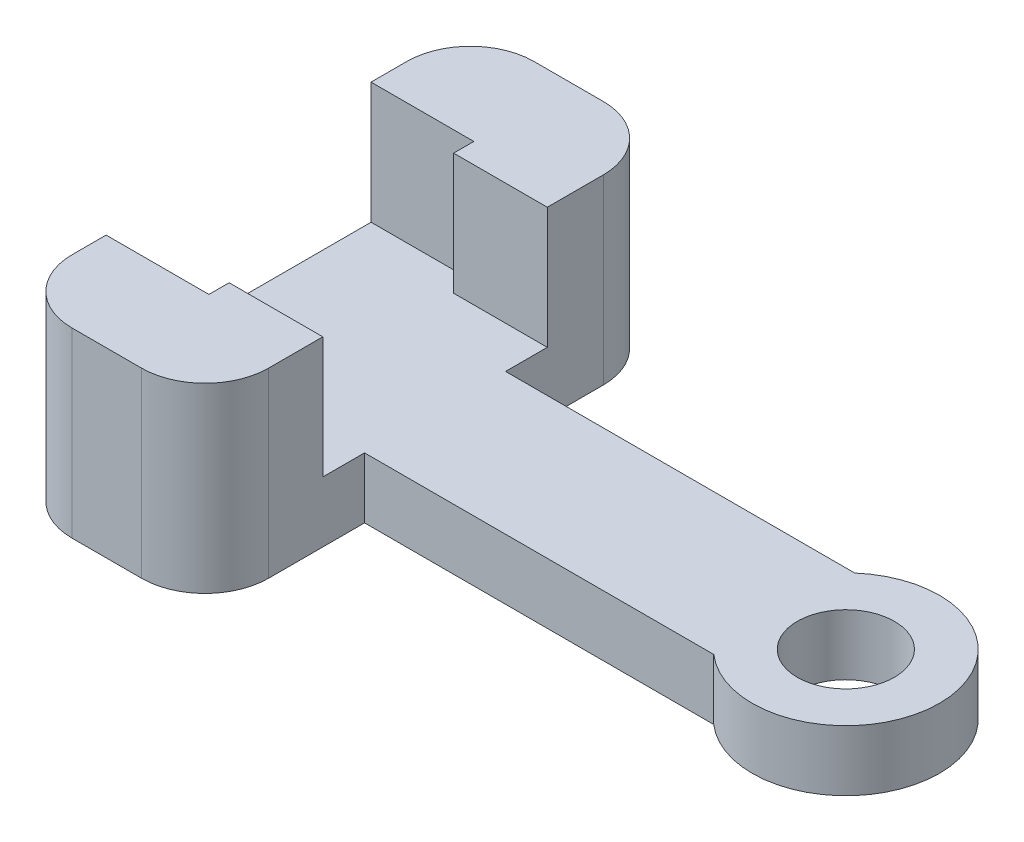
ISO-10303-21;
HEADER;
FILE_DESCRIPTION(('STEP AP214'),'2;1');
FILE_NAME('part.step','',(''),(''),'','','');
FILE_SCHEMA(('AUTOMOTIVE_DESIGN { 1 0 10303 214 1 1 1 1 }'));
ENDSEC;
DATA;
#1=APPLICATION_CONTEXT('core data for automotive mechanical design processes');
#2=APPLICATION_PROTOCOL_DEFINITION('international standard','automotive_design',2000,#1);
#3=PRODUCT_CONTEXT('',#1,'mechanical');
#4=PRODUCT('Part','Part','',(#3));
#5=PRODUCT_RELATED_PRODUCT_CATEGORY('part','',(#4));
#6=PRODUCT_DEFINITION_FORMATION('','',#4);
#7=PRODUCT_DEFINITION_CONTEXT('part definition',#1,'design');
#8=PRODUCT_DEFINITION('design','',#6,#7);
#9=PRODUCT_DEFINITION_SHAPE('','',#8);
#10=(LENGTH_UNIT() NAMED_UNIT(*) SI_UNIT(.MILLI.,.METRE.));
#11=(NAMED_UNIT(*) PLANE_ANGLE_UNIT() SI_UNIT($,.RADIAN.));
#12=(NAMED_UNIT(*) SI_UNIT($,.STERADIAN.) SOLID_ANGLE_UNIT());
#13=UNCERTAINTY_MEASURE_WITH_UNIT(LENGTH_MEASURE(1.E-05),#10,'distance_accuracy_value','');
#14=(GEOMETRIC_REPRESENTATION_CONTEXT(3) GLOBAL_UNCERTAINTY_ASSIGNED_CONTEXT((#13)) GLOBAL_UNIT_ASSIGNED_CONTEXT((#10,
#11,#12)) REPRESENTATION_CONTEXT('',''));
#15=CARTESIAN_POINT('',(0.,0.,0.));
#16=DIRECTION('',(0.,0.,1.));
#17=DIRECTION('',(1.,0.,0.));
#18=AXIS2_PLACEMENT_3D('',#15,#16,#17);
#19=CARTESIAN_POINT('',(38.1627437184587,3.,7.28290251343929));
#20=DIRECTION('',(0.,1.,0.));
#21=DIRECTION('',(0.,0.,1.));
#22=AXIS2_PLACEMENT_3D('',#19,#20,#21);
#23=PLANE('',#22);
#24=DIRECTION('',(1.,0.,0.));
#25=VECTOR('',#24,1.);
#26=CARTESIAN_POINT('',(0.,3.,12.8329025134393));
#27=LINE('',#26,#25);
#28=CARTESIAN_POINT('',(13.2204073400067,3.,12.8329025134393));
#29=VERTEX_POINT('',#28);
#30=CARTESIAN_POINT('',(17.8518941028648,3.,12.8329025134393));
#31=VERTEX_POINT('',#30);
#32=EDGE_CURVE('E182',#29,#31,#27,.T.);
#33=ORIENTED_EDGE('',*,*,#32,.T.);
#34=DIRECTION('',(0.,0.,-1.));
#35=VECTOR('',#34,1.);
#36=CARTESIAN_POINT('',(17.8518941028648,3.,10.7686167991536));
#37=LINE('',#36,#35);
#38=CARTESIAN_POINT('',(17.8518941028648,3.,10.7686167991536));
#39=VERTEX_POINT('',#38);
#40=EDGE_CURVE('E279',#31,#39,#37,.T.);
#41=ORIENTED_EDGE('',*,*,#40,.T.);
#42=DIRECTION('',(1.,0.,0.));
#43=VECTOR('',#42,1.);
#44=CARTESIAN_POINT('',(35.1175065540075,3.,10.7686167991536));
#45=LINE('',#44,#43);
#46=CARTESIAN_POINT('',(35.1175065540075,3.,10.7686167991536));
#47=VERTEX_POINT('',#46);
#48=EDGE_CURVE('E287',#39,#47,#45,.T.);
#49=ORIENTED_EDGE('',*,*,#48,.T.);
#50=CARTESIAN_POINT('',(38.1627437184587,3.,7.28290251343929));
#51=DIRECTION('',(0.,1.,0.));
#52=DIRECTION('',(0.,0.,1.));
#53=AXIS2_PLACEMENT_3D('',#50,#51,#52);
#54=CIRCLE('',#53,4.62857142857144);
#55=CARTESIAN_POINT('',(35.1175065540075,3.,3.79718822772499));
#56=VERTEX_POINT('',#55);
#57=EDGE_CURVE('E316',#47,#56,#54,.T.);
#58=ORIENTED_EDGE('',*,*,#57,.T.);
#59=DIRECTION('',(-1.,0.,0.));
#60=VECTOR('',#59,1.);
#61=CARTESIAN_POINT('',(17.8518941028648,3.,3.79718822772499));
#62=LINE('',#61,#60);
#63=CARTESIAN_POINT('',(17.8518941028648,3.,3.79718822772499));
#64=VERTEX_POINT('',#63);
#65=EDGE_CURVE('E398',#56,#64,#62,.T.);
#66=ORIENTED_EDGE('',*,*,#65,.T.);
#67=DIRECTION('',(0.,0.,-1.));
#68=VECTOR('',#67,1.);
#69=CARTESIAN_POINT('',(17.8518941028648,3.,-1.03641527504467));
#70=LINE('',#69,#68);
#71=CARTESIAN_POINT('',(17.8518941028648,3.,1.7329025134393));
#72=VERTEX_POINT('',#71);
#73=EDGE_CURVE('E280',#64,#72,#70,.T.);
#74=ORIENTED_EDGE('',*,*,#73,.T.);
#75=DIRECTION('',(1.,0.,0.));
#76=VECTOR('',#75,1.);
#77=CARTESIAN_POINT('',(0.,3.,1.7329025134393));
#78=LINE('',#77,#76);
#79=CARTESIAN_POINT('',(13.2204073400067,3.,1.7329025134393));
#80=VERTEX_POINT('',#79);
#81=EDGE_CURVE('E228',#80,#72,#78,.T.);
#82=ORIENTED_EDGE('',*,*,#81,.F.);
#83=DIRECTION('',(0.,0.,1.));
#84=VECTOR('',#83,1.);
#85=CARTESIAN_POINT('',(13.2204073400067,3.,0.));
#86=LINE('',#85,#84);
#87=CARTESIAN_POINT('',(13.2204073400067,3.,0.732902513439297));
#88=VERTEX_POINT('',#87);
#89=EDGE_CURVE('E247',#88,#80,#86,.T.);
#90=ORIENTED_EDGE('',*,*,#89,.F.);
#91=DIRECTION('',(1.,0.,0.));
#92=VECTOR('',#91,1.);
#93=CARTESIAN_POINT('',(0.,3.,0.732902513439297));
#94=LINE('',#93,#92);
#95=CARTESIAN_POINT('',(8.13760838857907,3.,0.732902513439297));
#96=VERTEX_POINT('',#95);
#97=EDGE_CURVE('E184',#96,#88,#94,.T.);
#98=ORIENTED_EDGE('',*,*,#97,.F.);
#99=DIRECTION('',(0.,0.,1.));
#100=VECTOR('',#99,1.);
#101=CARTESIAN_POINT('',(8.13760838857907,3.,15.5114739420107));
#102=LINE('',#101,#100);
#103=CARTESIAN_POINT('',(8.13760838857907,3.,13.8329025134393));
#104=VERTEX_POINT('',#103);
#105=EDGE_CURVE('E276',#96,#104,#102,.T.);
#106=ORIENTED_EDGE('',*,*,#105,.T.);
#107=DIRECTION('',(1.,0.,0.));
#108=VECTOR('',#107,1.);
#109=CARTESIAN_POINT('',(0.,3.,13.8329025134393));
#110=LINE('',#109,#108);
#111=CARTESIAN_POINT('',(13.2204073400067,3.,13.8329025134393));
#112=VERTEX_POINT('',#111);
#113=EDGE_CURVE('E59',#104,#112,#110,.T.);
#114=ORIENTED_EDGE('',*,*,#113,.T.);
#115=DIRECTION('',(0.,0.,1.));
#116=VECTOR('',#115,1.);
#117=CARTESIAN_POINT('',(13.2204073400067,3.,0.));
#118=LINE('',#117,#116);
#119=EDGE_CURVE('E54',#29,#112,#118,.T.);
#120=ORIENTED_EDGE('',*,*,#119,.F.);
#121=EDGE_LOOP('',(#33,#41,#49,#58,#66,#74,#82,#90,#98,#106,#114,#120));
#122=FACE_BOUND('',#121,.T.);
#123=CARTESIAN_POINT('',(38.1627437184587,3.,7.28290251343929));
#124=DIRECTION('',(0.,1.,0.));
#125=DIRECTION('',(0.,0.,1.));
#126=AXIS2_PLACEMENT_3D('',#123,#124,#125);
#127=CIRCLE('',#126,2.4);
#128=CARTESIAN_POINT('',(38.1627437184587,3.,9.68290251343929));
#129=VERTEX_POINT('',#128);
#130=EDGE_CURVE('E294',#129,#129,#127,.T.);
#131=ORIENTED_EDGE('',*,*,#130,.F.);
#132=EDGE_LOOP('',(#131));
#133=FACE_BOUND('',#132,.T.);
#134=ADVANCED_FACE('F37',(#122,#133),#23,.T.);
#135=CARTESIAN_POINT('',(38.1627437184587,0.,7.28290251343929));
#136=DIRECTION('',(0.,1.,0.));
#137=DIRECTION('',(0.,0.,1.));
#138=AXIS2_PLACEMENT_3D('',#135,#136,#137);
#139=PLANE('',#138);
#140=CARTESIAN_POINT('',(38.1627437184587,0.,7.28290251343929));
#141=DIRECTION('',(0.,1.,0.));
#142=DIRECTION('',(0.,0.,1.));
#143=AXIS2_PLACEMENT_3D('',#140,#141,#142);
#144=CIRCLE('',#143,4.62857142857144);
#145=CARTESIAN_POINT('',(35.1175065540075,0.,10.7686167991536));
#146=VERTEX_POINT('',#145);
#147=CARTESIAN_POINT('',(35.1175065540075,0.,3.79718822772499));
#148=VERTEX_POINT('',#147);
#149=EDGE_CURVE('E290',#146,#148,#144,.T.);
#150=ORIENTED_EDGE('',*,*,#149,.F.);
#151=DIRECTION('',(1.,0.,0.));
#152=VECTOR('',#151,1.);
#153=CARTESIAN_POINT('',(35.1175065540075,0.,10.7686167991536));
#154=LINE('',#153,#152);
#155=CARTESIAN_POINT('',(17.8518941028648,0.,10.7686167991536));
#156=VERTEX_POINT('',#155);
#157=EDGE_CURVE('E314',#156,#146,#154,.T.);
#158=ORIENTED_EDGE('',*,*,#157,.F.);
#159=DIRECTION('',(0.,0.,-1.));
#160=VECTOR('',#159,1.);
#161=CARTESIAN_POINT('',(17.8518941028648,0.,10.7686167991536));
#162=LINE('',#161,#160);
#163=CARTESIAN_POINT('',(17.8518941028648,0.,15.5114739420107));
#164=VERTEX_POINT('',#163);
#165=EDGE_CURVE('E312',#164,#156,#162,.T.);
#166=ORIENTED_EDGE('',*,*,#165,.F.);
#167=CARTESIAN_POINT('',(14.7090369600077,0.,15.5114739420107));
#168=DIRECTION('',(0.,1.,0.));
#169=DIRECTION('',(0.,0.,1.));
#170=AXIS2_PLACEMENT_3D('',#167,#168,#169);
#171=CIRCLE('',#170,3.14285714285715);
#172=CARTESIAN_POINT('',(14.7090369600076,0.,18.6543310848679));
#173=VERTEX_POINT('',#172);
#174=EDGE_CURVE('E310',#173,#164,#171,.T.);
#175=ORIENTED_EDGE('',*,*,#174,.F.);
#176=DIRECTION('',(1.,0.,0.));
#177=VECTOR('',#176,1.);
#178=CARTESIAN_POINT('',(14.7090369600076,0.,18.6543310848679));
#179=LINE('',#178,#177);
#180=CARTESIAN_POINT('',(11.2804655314362,0.,18.6543310848679));
#181=VERTEX_POINT('',#180);
#182=EDGE_CURVE('E308',#181,#173,#179,.T.);
#183=ORIENTED_EDGE('',*,*,#182,.F.);
#184=CARTESIAN_POINT('',(11.2804655314362,0.,15.5114739420107));
#185=DIRECTION('',(0.,1.,0.));
#186=DIRECTION('',(0.,0.,1.));
#187=AXIS2_PLACEMENT_3D('',#184,#185,#186);
#188=CIRCLE('',#187,3.14285714285715);
#189=CARTESIAN_POINT('',(8.13760838857907,0.,15.5114739420107));
#190=VERTEX_POINT('',#189);
#191=EDGE_CURVE('E306',#190,#181,#188,.T.);
#192=ORIENTED_EDGE('',*,*,#191,.F.);
#193=DIRECTION('',(0.,0.,1.));
#194=VECTOR('',#193,1.);
#195=CARTESIAN_POINT('',(8.13760838857907,0.,15.5114739420107));
#196=LINE('',#195,#194);
#197=CARTESIAN_POINT('',(8.13760838857907,0.,-1.03641527504467));
#198=VERTEX_POINT('',#197);
#199=EDGE_CURVE('E304',#198,#190,#196,.T.);
#200=ORIENTED_EDGE('',*,*,#199,.F.);
#201=CARTESIAN_POINT('',(11.2804655314362,0.,-1.03641527504468));
#202=DIRECTION('',(0.,1.,0.));
#203=DIRECTION('',(0.,0.,1.));
#204=AXIS2_PLACEMENT_3D('',#201,#202,#203);
#205=CIRCLE('',#204,3.14285714285715);
#206=CARTESIAN_POINT('',(11.2804655314362,0.,-4.17927241790183));
#207=VERTEX_POINT('',#206);
#208=EDGE_CURVE('E302',#207,#198,#205,.T.);
#209=ORIENTED_EDGE('',*,*,#208,.F.);
#210=DIRECTION('',(-1.,0.,0.));
#211=VECTOR('',#210,1.);
#212=CARTESIAN_POINT('',(11.2804655314362,0.,-4.17927241790183));
#213=LINE('',#212,#211);
#214=CARTESIAN_POINT('',(14.7090369600076,0.,-4.17927241790183));
#215=VERTEX_POINT('',#214);
#216=EDGE_CURVE('E300',#215,#207,#213,.T.);
#217=ORIENTED_EDGE('',*,*,#216,.F.);
#218=CARTESIAN_POINT('',(14.7090369600077,0.,-1.03641527504468));
#219=DIRECTION('',(0.,1.,0.));
#220=DIRECTION('',(0.,0.,1.));
#221=AXIS2_PLACEMENT_3D('',#218,#219,#220);
#222=CIRCLE('',#221,3.14285714285715);
#223=CARTESIAN_POINT('',(17.8518941028648,0.,-1.03641527504467));
#224=VERTEX_POINT('',#223);
#225=EDGE_CURVE('E298',#224,#215,#222,.T.);
#226=ORIENTED_EDGE('',*,*,#225,.F.);
#227=DIRECTION('',(0.,0.,-1.));
#228=VECTOR('',#227,1.);
#229=CARTESIAN_POINT('',(17.8518941028648,0.,-1.03641527504467));
#230=LINE('',#229,#228);
#231=CARTESIAN_POINT('',(17.8518941028648,0.,3.79718822772499));
#232=VERTEX_POINT('',#231);
#233=EDGE_CURVE('E296',#232,#224,#230,.T.);
#234=ORIENTED_EDGE('',*,*,#233,.F.);
#235=DIRECTION('',(-1.,0.,0.));
#236=VECTOR('',#235,1.);
#237=CARTESIAN_POINT('',(17.8518941028648,0.,3.79718822772499));
#238=LINE('',#237,#236);
#239=EDGE_CURVE('E293',#148,#232,#238,.T.);
#240=ORIENTED_EDGE('',*,*,#239,.F.);
#241=EDGE_LOOP('',(#150,#158,#166,#175,#183,#192,#200,#209,#217,#226,#234,#240));
#242=FACE_BOUND('',#241,.T.);
#243=CARTESIAN_POINT('',(38.1627437184587,0.,7.28290251343929));
#244=DIRECTION('',(0.,1.,0.));
#245=DIRECTION('',(0.,0.,1.));
#246=AXIS2_PLACEMENT_3D('',#243,#244,#245);
#247=CIRCLE('',#246,2.4);
#248=CARTESIAN_POINT('',(38.1627437184587,0.,9.68290251343929));
#249=VERTEX_POINT('',#248);
#250=EDGE_CURVE('E401',#249,#249,#247,.T.);
#251=ORIENTED_EDGE('',*,*,#250,.T.);
#252=EDGE_LOOP('',(#251));
#253=FACE_BOUND('',#252,.T.);
#254=ADVANCED_FACE('F354',(#242,#253),#139,.F.);
#255=CARTESIAN_POINT('',(38.1627437184587,3.,7.28290251343929));
#256=DIRECTION('',(0.,-1.,0.));
#257=DIRECTION('',(0.,0.,-1.));
#258=AXIS2_PLACEMENT_3D('',#255,#256,#257);
#259=CYLINDRICAL_SURFACE('',#258,4.62857142857144);
#260=ORIENTED_EDGE('',*,*,#149,.T.);
#261=DIRECTION('',(0.,-1.,0.));
#262=VECTOR('',#261,1.);
#263=CARTESIAN_POINT('',(35.1175065540075,3.,3.79718822772499));
#264=LINE('',#263,#262);
#265=EDGE_CURVE('E11',#56,#148,#264,.T.);
#266=ORIENTED_EDGE('',*,*,#265,.F.);
#267=ORIENTED_EDGE('',*,*,#57,.F.);
#268=DIRECTION('',(0.,-1.,0.));
#269=VECTOR('',#268,1.);
#270=CARTESIAN_POINT('',(35.1175065540075,3.,10.7686167991536));
#271=LINE('',#270,#269);
#272=EDGE_CURVE('E289',#47,#146,#271,.T.);
#273=ORIENTED_EDGE('',*,*,#272,.T.);
#274=EDGE_LOOP('',(#260,#266,#267,#273));
#275=FACE_BOUND('',#274,.T.);
#276=ADVANCED_FACE('F39',(#275),#259,.T.);
#277=CARTESIAN_POINT('',(17.8518941028648,3.,3.79718822772499));
#278=DIRECTION('',(0.,0.,1.));
#279=DIRECTION('',(1.,0.,0.));
#280=AXIS2_PLACEMENT_3D('',#277,#278,#279);
#281=PLANE('',#280);
#282=ORIENTED_EDGE('',*,*,#239,.T.);
#283=DIRECTION('',(0.,-1.,0.));
#284=VECTOR('',#283,1.);
#285=CARTESIAN_POINT('',(17.8518941028648,3.,3.79718822772499));
#286=LINE('',#285,#284);
#287=EDGE_CURVE('E46',#64,#232,#286,.T.);
#288=ORIENTED_EDGE('',*,*,#287,.F.);
#289=ORIENTED_EDGE('',*,*,#65,.F.);
#290=ORIENTED_EDGE('',*,*,#265,.T.);
#291=EDGE_LOOP('',(#282,#288,#289,#290));
#292=FACE_BOUND('',#291,.T.);
#293=ADVANCED_FACE('F453',(#292),#281,.F.);
#294=CARTESIAN_POINT('',(17.8518941028648,3.,-1.03641527504467));
#295=DIRECTION('',(-1.,0.,0.));
#296=DIRECTION('',(0.,0.,1.));
#297=AXIS2_PLACEMENT_3D('',#294,#295,#296);
#298=PLANE('',#297);
#299=ORIENTED_EDGE('',*,*,#233,.T.);
#300=DIRECTION('',(0.,-1.,0.));
#301=VECTOR('',#300,1.);
#302=CARTESIAN_POINT('',(17.8518941028648,3.,-1.03641527504467));
#303=LINE('',#302,#301);
#304=CARTESIAN_POINT('',(17.8518941028648,9.,-1.03641527504467));
#305=VERTEX_POINT('',#304);
#306=EDGE_CURVE('E343',#305,#224,#303,.T.);
#307=ORIENTED_EDGE('',*,*,#306,.F.);
#308=DIRECTION('',(0.,0.,-1.));
#309=VECTOR('',#308,1.);
#310=CARTESIAN_POINT('',(17.8518941028648,9.,0.));
#311=LINE('',#310,#309);
#312=CARTESIAN_POINT('',(17.8518941028648,9.,1.7329025134393));
#313=VERTEX_POINT('',#312);
#314=EDGE_CURVE('E232',#313,#305,#311,.T.);
#315=ORIENTED_EDGE('',*,*,#314,.F.);
#316=DIRECTION('',(0.,-1.,0.));
#317=VECTOR('',#316,1.);
#318=CARTESIAN_POINT('',(17.8518941028648,9.,1.7329025134393));
#319=LINE('',#318,#317);
#320=EDGE_CURVE('E259',#313,#72,#319,.T.);
#321=ORIENTED_EDGE('',*,*,#320,.T.);
#322=ORIENTED_EDGE('',*,*,#73,.F.);
#323=ORIENTED_EDGE('',*,*,#287,.T.);
#324=EDGE_LOOP('',(#299,#307,#315,#321,#322,#323));
#325=FACE_BOUND('',#324,.T.);
#326=ADVANCED_FACE('F349',(#325),#298,.F.);
#327=CARTESIAN_POINT('',(14.7090369600077,3.,-1.03641527504468));
#328=DIRECTION('',(0.,-1.,0.));
#329=DIRECTION('',(0.,0.,-1.));
#330=AXIS2_PLACEMENT_3D('',#327,#328,#329);
#331=CYLINDRICAL_SURFACE('',#330,3.14285714285715);
#332=ORIENTED_EDGE('',*,*,#225,.T.);
#333=DIRECTION('',(0.,-1.,0.));
#334=VECTOR('',#333,1.);
#335=CARTESIAN_POINT('',(14.7090369600076,3.,-4.17927241790183));
#336=LINE('',#335,#334);
#337=CARTESIAN_POINT('',(14.7090369600076,9.,-4.17927241790183));
#338=VERTEX_POINT('',#337);
#339=EDGE_CURVE('E340',#338,#215,#336,.T.);
#340=ORIENTED_EDGE('',*,*,#339,.F.);
#341=CARTESIAN_POINT('',(14.7090369600077,9.,-1.03641527504468));
#342=DIRECTION('',(0.,1.,0.));
#343=DIRECTION('',(0.,0.,1.));
#344=AXIS2_PLACEMENT_3D('',#341,#342,#343);
#345=CIRCLE('',#344,3.14285714285715);
#346=EDGE_CURVE('E235',#305,#338,#345,.T.);
#347=ORIENTED_EDGE('',*,*,#346,.F.);
#348=ORIENTED_EDGE('',*,*,#306,.T.);
#349=EDGE_LOOP('',(#332,#340,#347,#348));
#350=FACE_BOUND('',#349,.T.);
#351=ADVANCED_FACE('F359',(#350),#331,.T.);
#352=CARTESIAN_POINT('',(11.2804655314362,3.,-4.17927241790183));
#353=DIRECTION('',(0.,0.,1.));
#354=DIRECTION('',(1.,0.,0.));
#355=AXIS2_PLACEMENT_3D('',#352,#353,#354);
#356=PLANE('',#355);
#357=ORIENTED_EDGE('',*,*,#216,.T.);
#358=DIRECTION('',(0.,-1.,0.));
#359=VECTOR('',#358,1.);
#360=CARTESIAN_POINT('',(11.2804655314362,3.,-4.17927241790183));
#361=LINE('',#360,#359);
#362=CARTESIAN_POINT('',(11.2804655314362,9.,-4.17927241790183));
#363=VERTEX_POINT('',#362);
#364=EDGE_CURVE('E337',#363,#207,#361,.T.);
#365=ORIENTED_EDGE('',*,*,#364,.F.);
#366=DIRECTION('',(-1.,0.,0.));
#367=VECTOR('',#366,1.);
#368=CARTESIAN_POINT('',(0.,9.,-4.17927241790183));
#369=LINE('',#368,#367);
#370=EDGE_CURVE('E238',#338,#363,#369,.T.);
#371=ORIENTED_EDGE('',*,*,#370,.F.);
#372=ORIENTED_EDGE('',*,*,#339,.T.);
#373=EDGE_LOOP('',(#357,#365,#371,#372));
#374=FACE_BOUND('',#373,.T.);
#375=ADVANCED_FACE('F363',(#374),#356,.F.);
#376=CARTESIAN_POINT('',(11.2804655314362,3.,-1.03641527504468));
#377=DIRECTION('',(0.,-1.,0.));
#378=DIRECTION('',(0.,0.,-1.));
#379=AXIS2_PLACEMENT_3D('',#376,#377,#378);
#380=CYLINDRICAL_SURFACE('',#379,3.14285714285715);
#381=ORIENTED_EDGE('',*,*,#208,.T.);
#382=DIRECTION('',(0.,-1.,0.));
#383=VECTOR('',#382,1.);
#384=CARTESIAN_POINT('',(8.13760838857907,3.,-1.03641527504467));
#385=LINE('',#384,#383);
#386=CARTESIAN_POINT('',(8.13760838857907,9.,-1.03641527504467));
#387=VERTEX_POINT('',#386);
#388=EDGE_CURVE('E334',#387,#198,#385,.T.);
#389=ORIENTED_EDGE('',*,*,#388,.F.);
#390=CARTESIAN_POINT('',(11.2804655314362,9.,-1.03641527504468));
#391=DIRECTION('',(0.,1.,0.));
#392=DIRECTION('',(0.,0.,1.));
#393=AXIS2_PLACEMENT_3D('',#390,#391,#392);
#394=CIRCLE('',#393,3.14285714285715);
#395=EDGE_CURVE('E241',#363,#387,#394,.T.);
#396=ORIENTED_EDGE('',*,*,#395,.F.);
#397=ORIENTED_EDGE('',*,*,#364,.T.);
#398=EDGE_LOOP('',(#381,#389,#396,#397));
#399=FACE_BOUND('',#398,.T.);
#400=ADVANCED_FACE('F369',(#399),#380,.T.);
#401=CARTESIAN_POINT('',(8.13760838857907,3.,15.5114739420107));
#402=DIRECTION('',(1.,0.,0.));
#403=DIRECTION('',(0.,0.,-1.));
#404=AXIS2_PLACEMENT_3D('',#401,#402,#403);
#405=PLANE('',#404);
#406=ORIENTED_EDGE('',*,*,#199,.T.);
#407=DIRECTION('',(0.,-1.,0.));
#408=VECTOR('',#407,1.);
#409=CARTESIAN_POINT('',(8.13760838857907,3.,15.5114739420107));
#410=LINE('',#409,#408);
#411=CARTESIAN_POINT('',(8.13760838857907,9.,15.5114739420107));
#412=VERTEX_POINT('',#411);
#413=EDGE_CURVE('E331',#412,#190,#410,.T.);
#414=ORIENTED_EDGE('',*,*,#413,.F.);
#415=DIRECTION('',(0.,0.,1.));
#416=VECTOR('',#415,1.);
#417=CARTESIAN_POINT('',(8.13760838857907,9.,0.));
#418=LINE('',#417,#416);
#419=CARTESIAN_POINT('',(8.13760838857907,9.,13.8329025134393));
#420=VERTEX_POINT('',#419);
#421=EDGE_CURVE('E204',#420,#412,#418,.T.);
#422=ORIENTED_EDGE('',*,*,#421,.F.);
#423=DIRECTION('',(0.,-1.,0.));
#424=VECTOR('',#423,1.);
#425=CARTESIAN_POINT('',(8.13760838857907,9.,13.8329025134393));
#426=LINE('',#425,#424);
#427=EDGE_CURVE('E220',#420,#104,#426,.T.);
#428=ORIENTED_EDGE('',*,*,#427,.T.);
#429=ORIENTED_EDGE('',*,*,#105,.F.);
#430=DIRECTION('',(0.,-1.,0.));
#431=VECTOR('',#430,1.);
#432=CARTESIAN_POINT('',(8.13760838857907,9.,0.732902513439297));
#433=LINE('',#432,#431);
#434=CARTESIAN_POINT('',(8.13760838857907,9.,0.732902513439297));
#435=VERTEX_POINT('',#434);
#436=EDGE_CURVE('E246',#435,#96,#433,.T.);
#437=ORIENTED_EDGE('',*,*,#436,.F.);
#438=DIRECTION('',(0.,0.,1.));
#439=VECTOR('',#438,1.);
#440=CARTESIAN_POINT('',(8.13760838857907,9.,0.));
#441=LINE('',#440,#439);
#442=EDGE_CURVE('E244',#387,#435,#441,.T.);
#443=ORIENTED_EDGE('',*,*,#442,.F.);
#444=ORIENTED_EDGE('',*,*,#388,.T.);
#445=EDGE_LOOP('',(#406,#414,#422,#428,#429,#437,#443,#444));
#446=FACE_BOUND('',#445,.T.);
#447=ADVANCED_FACE('F372',(#446),#405,.F.);
#448=CARTESIAN_POINT('',(11.2804655314362,3.,15.5114739420107));
#449=DIRECTION('',(0.,-1.,0.));
#450=DIRECTION('',(0.,0.,-1.));
#451=AXIS2_PLACEMENT_3D('',#448,#449,#450);
#452=CYLINDRICAL_SURFACE('',#451,3.14285714285715);
#453=ORIENTED_EDGE('',*,*,#191,.T.);
#454=DIRECTION('',(0.,-1.,0.));
#455=VECTOR('',#454,1.);
#456=CARTESIAN_POINT('',(11.2804655314362,3.,18.6543310848679));
#457=LINE('',#456,#455);
#458=CARTESIAN_POINT('',(11.2804655314362,9.,18.6543310848679));
#459=VERTEX_POINT('',#458);
#460=EDGE_CURVE('E328',#459,#181,#457,.T.);
#461=ORIENTED_EDGE('',*,*,#460,.F.);
#462=CARTESIAN_POINT('',(11.2804655314362,9.,15.5114739420107));
#463=DIRECTION('',(0.,1.,0.));
#464=DIRECTION('',(0.,0.,1.));
#465=AXIS2_PLACEMENT_3D('',#462,#463,#464);
#466=CIRCLE('',#465,3.14285714285715);
#467=EDGE_CURVE('E207',#412,#459,#466,.T.);
#468=ORIENTED_EDGE('',*,*,#467,.F.);
#469=ORIENTED_EDGE('',*,*,#413,.T.);
#470=EDGE_LOOP('',(#453,#461,#468,#469));
#471=FACE_BOUND('',#470,.T.);
#472=ADVANCED_FACE('F377',(#471),#452,.T.);
#473=CARTESIAN_POINT('',(14.7090369600076,3.,18.6543310848679));
#474=DIRECTION('',(0.,0.,-1.));
#475=DIRECTION('',(-1.,0.,0.));
#476=AXIS2_PLACEMENT_3D('',#473,#474,#475);
#477=PLANE('',#476);
#478=ORIENTED_EDGE('',*,*,#182,.T.);
#479=DIRECTION('',(0.,-1.,0.));
#480=VECTOR('',#479,1.);
#481=CARTESIAN_POINT('',(14.7090369600076,3.,18.6543310848679));
#482=LINE('',#481,#480);
#483=CARTESIAN_POINT('',(14.7090369600077,9.,18.6543310848679));
#484=VERTEX_POINT('',#483);
#485=EDGE_CURVE('E325',#484,#173,#482,.T.);
#486=ORIENTED_EDGE('',*,*,#485,.F.);
#487=DIRECTION('',(1.,0.,0.));
#488=VECTOR('',#487,1.);
#489=CARTESIAN_POINT('',(0.,9.,18.6543310848679));
#490=LINE('',#489,#488);
#491=EDGE_CURVE('E210',#459,#484,#490,.T.);
#492=ORIENTED_EDGE('',*,*,#491,.F.);
#493=ORIENTED_EDGE('',*,*,#460,.T.);
#494=EDGE_LOOP('',(#478,#486,#492,#493));
#495=FACE_BOUND('',#494,.T.);
#496=ADVANCED_FACE('F381',(#495),#477,.F.);
#497=CARTESIAN_POINT('',(14.7090369600077,3.,15.5114739420107));
#498=DIRECTION('',(0.,-1.,0.));
#499=DIRECTION('',(0.,0.,-1.));
#500=AXIS2_PLACEMENT_3D('',#497,#498,#499);
#501=CYLINDRICAL_SURFACE('',#500,3.14285714285715);
#502=ORIENTED_EDGE('',*,*,#174,.T.);
#503=DIRECTION('',(0.,-1.,0.));
#504=VECTOR('',#503,1.);
#505=CARTESIAN_POINT('',(17.8518941028648,3.,15.5114739420107));
#506=LINE('',#505,#504);
#507=CARTESIAN_POINT('',(17.8518941028648,9.,15.5114739420107));
#508=VERTEX_POINT('',#507);
#509=EDGE_CURVE('E322',#508,#164,#506,.T.);
#510=ORIENTED_EDGE('',*,*,#509,.F.);
#511=CARTESIAN_POINT('',(14.7090369600077,9.,15.5114739420107));
#512=DIRECTION('',(0.,1.,0.));
#513=DIRECTION('',(0.,0.,1.));
#514=AXIS2_PLACEMENT_3D('',#511,#512,#513);
#515=CIRCLE('',#514,3.14285714285715);
#516=EDGE_CURVE('E213',#484,#508,#515,.T.);
#517=ORIENTED_EDGE('',*,*,#516,.F.);
#518=ORIENTED_EDGE('',*,*,#485,.T.);
#519=EDGE_LOOP('',(#502,#510,#517,#518));
#520=FACE_BOUND('',#519,.T.);
#521=ADVANCED_FACE('F384',(#520),#501,.T.);
#522=CARTESIAN_POINT('',(17.8518941028648,3.,10.7686167991536));
#523=DIRECTION('',(-1.,0.,0.));
#524=DIRECTION('',(0.,0.,1.));
#525=AXIS2_PLACEMENT_3D('',#522,#523,#524);
#526=PLANE('',#525);
#527=ORIENTED_EDGE('',*,*,#165,.T.);
#528=DIRECTION('',(0.,-1.,0.));
#529=VECTOR('',#528,1.);
#530=CARTESIAN_POINT('',(17.8518941028648,3.,10.7686167991536));
#531=LINE('',#530,#529);
#532=EDGE_CURVE('E319',#39,#156,#531,.T.);
#533=ORIENTED_EDGE('',*,*,#532,.F.);
#534=ORIENTED_EDGE('',*,*,#40,.F.);
#535=DIRECTION('',(0.,-1.,0.));
#536=VECTOR('',#535,1.);
#537=CARTESIAN_POINT('',(17.8518941028648,9.,12.8329025134393));
#538=LINE('',#537,#536);
#539=CARTESIAN_POINT('',(17.8518941028648,9.,12.8329025134393));
#540=VERTEX_POINT('',#539);
#541=EDGE_CURVE('E216',#540,#31,#538,.T.);
#542=ORIENTED_EDGE('',*,*,#541,.F.);
#543=DIRECTION('',(0.,0.,-1.));
#544=VECTOR('',#543,1.);
#545=CARTESIAN_POINT('',(17.8518941028648,9.,0.));
#546=LINE('',#545,#544);
#547=EDGE_CURVE('E198',#508,#540,#546,.T.);
#548=ORIENTED_EDGE('',*,*,#547,.F.);
#549=ORIENTED_EDGE('',*,*,#509,.T.);
#550=EDGE_LOOP('',(#527,#533,#534,#542,#548,#549));
#551=FACE_BOUND('',#550,.T.);
#552=ADVANCED_FACE('F387',(#551),#526,.F.);
#553=CARTESIAN_POINT('',(35.1175065540075,3.,10.7686167991536));
#554=DIRECTION('',(0.,0.,-1.));
#555=DIRECTION('',(-1.,0.,0.));
#556=AXIS2_PLACEMENT_3D('',#553,#554,#555);
#557=PLANE('',#556);
#558=ORIENTED_EDGE('',*,*,#157,.T.);
#559=ORIENTED_EDGE('',*,*,#272,.F.);
#560=ORIENTED_EDGE('',*,*,#48,.F.);
#561=ORIENTED_EDGE('',*,*,#532,.T.);
#562=EDGE_LOOP('',(#558,#559,#560,#561));
#563=FACE_BOUND('',#562,.T.);
#564=ADVANCED_FACE('F392',(#563),#557,.F.);
#565=CARTESIAN_POINT('',(38.1627437184587,3.,7.28290251343929));
#566=DIRECTION('',(0.,-1.,0.));
#567=DIRECTION('',(0.,0.,-1.));
#568=AXIS2_PLACEMENT_3D('',#565,#566,#567);
#569=CYLINDRICAL_SURFACE('',#568,2.4);
#570=ORIENTED_EDGE('',*,*,#130,.T.);
#571=EDGE_LOOP('',(#570));
#572=FACE_BOUND('',#571,.T.);
#573=ORIENTED_EDGE('',*,*,#250,.F.);
#574=EDGE_LOOP('',(#573));
#575=FACE_BOUND('',#574,.T.);
#576=ADVANCED_FACE('F431',(#572,#575),#569,.F.);
#577=CARTESIAN_POINT('',(0.,9.,0.732902513439297));
#578=DIRECTION('',(0.,0.,-1.));
#579=DIRECTION('',(-1.,0.,0.));
#580=AXIS2_PLACEMENT_3D('',#577,#578,#579);
#581=PLANE('',#580);
#582=ORIENTED_EDGE('',*,*,#97,.T.);
#583=DIRECTION('',(0.,-1.,0.));
#584=VECTOR('',#583,1.);
#585=CARTESIAN_POINT('',(13.2204073400067,9.,0.732902513439297));
#586=LINE('',#585,#584);
#587=CARTESIAN_POINT('',(13.2204073400067,9.,0.732902513439297));
#588=VERTEX_POINT('',#587);
#589=EDGE_CURVE('E266',#588,#88,#586,.T.);
#590=ORIENTED_EDGE('',*,*,#589,.F.);
#591=DIRECTION('',(1.,0.,0.));
#592=VECTOR('',#591,1.);
#593=CARTESIAN_POINT('',(0.,9.,0.732902513439297));
#594=LINE('',#593,#592);
#595=EDGE_CURVE('E224',#435,#588,#594,.T.);
#596=ORIENTED_EDGE('',*,*,#595,.F.);
#597=ORIENTED_EDGE('',*,*,#436,.T.);
#598=EDGE_LOOP('',(#582,#590,#596,#597));
#599=FACE_BOUND('',#598,.T.);
#600=ADVANCED_FACE('F410',(#599),#581,.F.);
#601=CARTESIAN_POINT('',(13.2204073400067,9.,0.));
#602=DIRECTION('',(1.,0.,0.));
#603=DIRECTION('',(0.,0.,-1.));
#604=AXIS2_PLACEMENT_3D('',#601,#602,#603);
#605=PLANE('',#604);
#606=ORIENTED_EDGE('',*,*,#89,.T.);
#607=DIRECTION('',(0.,-1.,0.));
#608=VECTOR('',#607,1.);
#609=CARTESIAN_POINT('',(13.2204073400067,9.,1.7329025134393));
#610=LINE('',#609,#608);
#611=CARTESIAN_POINT('',(13.2204073400067,9.,1.7329025134393));
#612=VERTEX_POINT('',#611);
#613=EDGE_CURVE('E252',#612,#80,#610,.T.);
#614=ORIENTED_EDGE('',*,*,#613,.F.);
#615=DIRECTION('',(0.,0.,1.));
#616=VECTOR('',#615,1.);
#617=CARTESIAN_POINT('',(13.2204073400067,9.,0.));
#618=LINE('',#617,#616);
#619=EDGE_CURVE('E227',#588,#612,#618,.T.);
#620=ORIENTED_EDGE('',*,*,#619,.F.);
#621=ORIENTED_EDGE('',*,*,#589,.T.);
#622=EDGE_LOOP('',(#606,#614,#620,#621));
#623=FACE_BOUND('',#622,.T.);
#624=ADVANCED_FACE('F408',(#623),#605,.F.);
#625=CARTESIAN_POINT('',(0.,9.,1.7329025134393));
#626=DIRECTION('',(0.,0.,-1.));
#627=DIRECTION('',(-1.,0.,0.));
#628=AXIS2_PLACEMENT_3D('',#625,#626,#627);
#629=PLANE('',#628);
#630=ORIENTED_EDGE('',*,*,#81,.T.);
#631=ORIENTED_EDGE('',*,*,#320,.F.);
#632=DIRECTION('',(1.,0.,0.));
#633=VECTOR('',#632,1.);
#634=CARTESIAN_POINT('',(0.,9.,1.7329025134393));
#635=LINE('',#634,#633);
#636=EDGE_CURVE('E230',#612,#313,#635,.T.);
#637=ORIENTED_EDGE('',*,*,#636,.F.);
#638=ORIENTED_EDGE('',*,*,#613,.T.);
#639=EDGE_LOOP('',(#630,#631,#637,#638));
#640=FACE_BOUND('',#639,.T.);
#641=ADVANCED_FACE('F459',(#640),#629,.F.);
#642=CARTESIAN_POINT('',(0.,9.,0.));
#643=DIRECTION('',(0.,1.,0.));
#644=DIRECTION('',(0.,0.,1.));
#645=AXIS2_PLACEMENT_3D('',#642,#643,#644);
#646=PLANE('',#645);
#647=ORIENTED_EDGE('',*,*,#595,.T.);
#648=ORIENTED_EDGE('',*,*,#619,.T.);
#649=ORIENTED_EDGE('',*,*,#636,.T.);
#650=ORIENTED_EDGE('',*,*,#314,.T.);
#651=ORIENTED_EDGE('',*,*,#346,.T.);
#652=ORIENTED_EDGE('',*,*,#370,.T.);
#653=ORIENTED_EDGE('',*,*,#395,.T.);
#654=ORIENTED_EDGE('',*,*,#442,.T.);
#655=EDGE_LOOP('',(#647,#648,#649,#650,#651,#652,#653,#654));
#656=FACE_BOUND('',#655,.T.);
#657=ADVANCED_FACE('F366',(#656),#646,.T.);
#658=CARTESIAN_POINT('',(0.,9.,12.8329025134393));
#659=DIRECTION('',(0.,0.,-1.));
#660=DIRECTION('',(-1.,0.,0.));
#661=AXIS2_PLACEMENT_3D('',#658,#659,#660);
#662=PLANE('',#661);
#663=ORIENTED_EDGE('',*,*,#32,.F.);
#664=DIRECTION('',(0.,-1.,0.));
#665=VECTOR('',#664,1.);
#666=CARTESIAN_POINT('',(13.2204073400067,9.,12.8329025134393));
#667=LINE('',#666,#665);
#668=CARTESIAN_POINT('',(13.2204073400067,9.,12.8329025134393));
#669=VERTEX_POINT('',#668);
#670=EDGE_CURVE('E176',#669,#29,#667,.T.);
#671=ORIENTED_EDGE('',*,*,#670,.F.);
#672=DIRECTION('',(1.,0.,0.));
#673=VECTOR('',#672,1.);
#674=CARTESIAN_POINT('',(0.,9.,12.8329025134393));
#675=LINE('',#674,#673);
#676=EDGE_CURVE('E181',#669,#540,#675,.T.);
#677=ORIENTED_EDGE('',*,*,#676,.T.);
#678=ORIENTED_EDGE('',*,*,#541,.T.);
#679=EDGE_LOOP('',(#663,#671,#677,#678));
#680=FACE_BOUND('',#679,.T.);
#681=ADVANCED_FACE('F178',(#680),#662,.T.);
#682=CARTESIAN_POINT('',(13.2204073400067,9.,0.));
#683=DIRECTION('',(1.,0.,0.));
#684=DIRECTION('',(0.,0.,-1.));
#685=AXIS2_PLACEMENT_3D('',#682,#683,#684);
#686=PLANE('',#685);
#687=ORIENTED_EDGE('',*,*,#119,.T.);
#688=DIRECTION('',(0.,-1.,0.));
#689=VECTOR('',#688,1.);
#690=CARTESIAN_POINT('',(13.2204073400067,9.,13.8329025134393));
#691=LINE('',#690,#689);
#692=CARTESIAN_POINT('',(13.2204073400067,9.,13.8329025134393));
#693=VERTEX_POINT('',#692);
#694=EDGE_CURVE('E185',#693,#112,#691,.T.);
#695=ORIENTED_EDGE('',*,*,#694,.F.);
#696=DIRECTION('',(0.,0.,1.));
#697=VECTOR('',#696,1.);
#698=CARTESIAN_POINT('',(13.2204073400067,9.,0.));
#699=LINE('',#698,#697);
#700=EDGE_CURVE('E188',#669,#693,#699,.T.);
#701=ORIENTED_EDGE('',*,*,#700,.F.);
#702=ORIENTED_EDGE('',*,*,#670,.T.);
#703=EDGE_LOOP('',(#687,#695,#701,#702));
#704=FACE_BOUND('',#703,.T.);
#705=ADVANCED_FACE('F189',(#704),#686,.F.);
#706=CARTESIAN_POINT('',(0.,9.,13.8329025134393));
#707=DIRECTION('',(0.,0.,-1.));
#708=DIRECTION('',(-1.,0.,0.));
#709=AXIS2_PLACEMENT_3D('',#706,#707,#708);
#710=PLANE('',#709);
#711=ORIENTED_EDGE('',*,*,#113,.F.);
#712=ORIENTED_EDGE('',*,*,#427,.F.);
#713=DIRECTION('',(1.,0.,0.));
#714=VECTOR('',#713,1.);
#715=CARTESIAN_POINT('',(0.,9.,13.8329025134393));
#716=LINE('',#715,#714);
#717=EDGE_CURVE('E193',#420,#693,#716,.T.);
#718=ORIENTED_EDGE('',*,*,#717,.T.);
#719=ORIENTED_EDGE('',*,*,#694,.T.);
#720=EDGE_LOOP('',(#711,#712,#718,#719));
#721=FACE_BOUND('',#720,.T.);
#722=ADVANCED_FACE('F415',(#721),#710,.T.);
#723=CARTESIAN_POINT('',(0.,9.,0.));
#724=DIRECTION('',(0.,1.,0.));
#725=DIRECTION('',(0.,0.,1.));
#726=AXIS2_PLACEMENT_3D('',#723,#724,#725);
#727=PLANE('',#726);
#728=ORIENTED_EDGE('',*,*,#676,.F.);
#729=ORIENTED_EDGE('',*,*,#700,.T.);
#730=ORIENTED_EDGE('',*,*,#717,.F.);
#731=ORIENTED_EDGE('',*,*,#421,.T.);
#732=ORIENTED_EDGE('',*,*,#467,.T.);
#733=ORIENTED_EDGE('',*,*,#491,.T.);
#734=ORIENTED_EDGE('',*,*,#516,.T.);
#735=ORIENTED_EDGE('',*,*,#547,.T.);
#736=EDGE_LOOP('',(#728,#729,#730,#731,#732,#733,#734,#735));
#737=FACE_BOUND('',#736,.T.);
#738=ADVANCED_FACE('F195',(#737),#727,.T.);
#739=CLOSED_SHELL('',(#134,#254,#276,#293,#326,#351,#375,#400,#447,#472,#496,#521,#552,#564,
#576,#600,#624,#641,#657,#681,#705,#722,#738));
#740=MANIFOLD_SOLID_BREP('B2',#739);
#741=ADVANCED_BREP_SHAPE_REPRESENTATION('',(#18,#740),#14);
#742=SHAPE_DEFINITION_REPRESENTATION(#9,#741);
ENDSEC;
END-ISO-10303-21;
